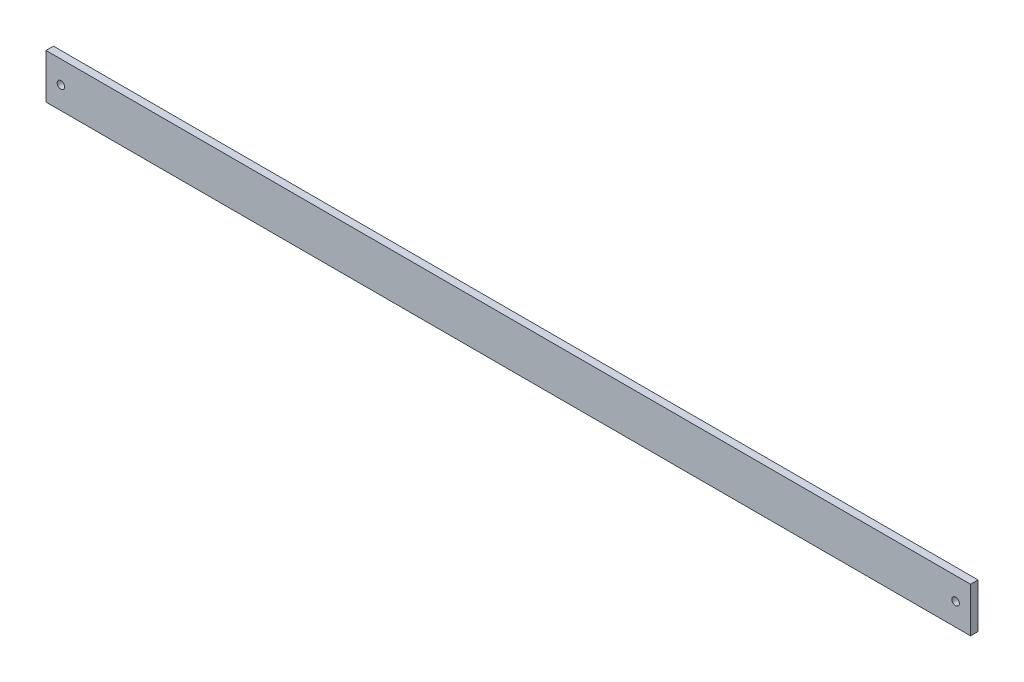
ISO-10303-21;
HEADER;
FILE_DESCRIPTION(('STEP AP214'),'2;1');
FILE_NAME('part.step','',(''),(''),'','','');
FILE_SCHEMA(('AUTOMOTIVE_DESIGN { 1 0 10303 214 1 1 1 1 }'));
ENDSEC;
DATA;
#1=APPLICATION_CONTEXT('core data for automotive mechanical design processes');
#2=APPLICATION_PROTOCOL_DEFINITION('international standard','automotive_design',2000,#1);
#3=PRODUCT_CONTEXT('',#1,'mechanical');
#4=PRODUCT('Part','Part','',(#3));
#5=PRODUCT_RELATED_PRODUCT_CATEGORY('part','',(#4));
#6=PRODUCT_DEFINITION_FORMATION('','',#4);
#7=PRODUCT_DEFINITION_CONTEXT('part definition',#1,'design');
#8=PRODUCT_DEFINITION('design','',#6,#7);
#9=PRODUCT_DEFINITION_SHAPE('','',#8);
#10=(LENGTH_UNIT() NAMED_UNIT(*) SI_UNIT(.MILLI.,.METRE.));
#11=(NAMED_UNIT(*) PLANE_ANGLE_UNIT() SI_UNIT($,.RADIAN.));
#12=(NAMED_UNIT(*) SI_UNIT($,.STERADIAN.) SOLID_ANGLE_UNIT());
#13=UNCERTAINTY_MEASURE_WITH_UNIT(LENGTH_MEASURE(1.E-05),#10,'distance_accuracy_value','');
#14=(GEOMETRIC_REPRESENTATION_CONTEXT(3) GLOBAL_UNCERTAINTY_ASSIGNED_CONTEXT((#13)) GLOBAL_UNIT_ASSIGNED_CONTEXT((#10,
#11,#12)) REPRESENTATION_CONTEXT('',''));
#15=CARTESIAN_POINT('',(0.,0.,0.));
#16=DIRECTION('',(0.,0.,1.));
#17=DIRECTION('',(1.,0.,0.));
#18=AXIS2_PLACEMENT_3D('',#15,#16,#17);
#19=CARTESIAN_POINT('',(0.,0.,3.175));
#20=DIRECTION('',(0.,0.,-1.));
#21=DIRECTION('',(-1.,0.,0.));
#22=AXIS2_PLACEMENT_3D('',#19,#20,#21);
#23=PLANE('',#22);
#24=DIRECTION('',(0.,-1.,0.));
#25=VECTOR('',#24,1.);
#26=CARTESIAN_POINT('',(0.,0.,3.175));
#27=LINE('',#26,#25);
#28=CARTESIAN_POINT('',(0.,19.05,3.175));
#29=VERTEX_POINT('',#28);
#30=CARTESIAN_POINT('',(0.,0.,3.175));
#31=VERTEX_POINT('',#30);
#32=EDGE_CURVE('E87',#29,#31,#27,.T.);
#33=ORIENTED_EDGE('',*,*,#32,.T.);
#34=DIRECTION('',(1.,0.,0.));
#35=VECTOR('',#34,1.);
#36=CARTESIAN_POINT('',(0.,0.,3.175));
#37=LINE('',#36,#35);
#38=CARTESIAN_POINT('',(393.7,0.,3.175));
#39=VERTEX_POINT('',#38);
#40=EDGE_CURVE('E82',#31,#39,#37,.T.);
#41=ORIENTED_EDGE('',*,*,#40,.T.);
#42=DIRECTION('',(0.,1.,0.));
#43=VECTOR('',#42,1.);
#44=CARTESIAN_POINT('',(393.7,0.,3.175));
#45=LINE('',#44,#43);
#46=CARTESIAN_POINT('',(393.7,19.05,3.175));
#47=VERTEX_POINT('',#46);
#48=EDGE_CURVE('E85',#39,#47,#45,.T.);
#49=ORIENTED_EDGE('',*,*,#48,.T.);
#50=DIRECTION('',(-1.,0.,0.));
#51=VECTOR('',#50,1.);
#52=CARTESIAN_POINT('',(0.,19.05,3.175));
#53=LINE('',#52,#51);
#54=EDGE_CURVE('E52',#47,#29,#53,.T.);
#55=ORIENTED_EDGE('',*,*,#54,.T.);
#56=EDGE_LOOP('',(#33,#41,#49,#55));
#57=FACE_BOUND('',#56,.T.);
#58=CARTESIAN_POINT('',(6.35,9.525,3.175));
#59=DIRECTION('',(0.,0.,1.));
#60=DIRECTION('',(1.,0.,0.));
#61=AXIS2_PLACEMENT_3D('',#58,#59,#60);
#62=CIRCLE('',#61,1.5875);
#63=CARTESIAN_POINT('',(7.9375,9.525,3.175));
#64=VERTEX_POINT('',#63);
#65=EDGE_CURVE('E102',#64,#64,#62,.T.);
#66=ORIENTED_EDGE('',*,*,#65,.F.);
#67=EDGE_LOOP('',(#66));
#68=FACE_BOUND('',#67,.T.);
#69=CARTESIAN_POINT('',(387.35,9.525,3.175));
#70=DIRECTION('',(0.,0.,1.));
#71=DIRECTION('',(1.,0.,0.));
#72=AXIS2_PLACEMENT_3D('',#69,#70,#71);
#73=CIRCLE('',#72,1.58750000000004);
#74=CARTESIAN_POINT('',(388.9375,9.525,3.175));
#75=VERTEX_POINT('',#74);
#76=EDGE_CURVE('E117',#75,#75,#73,.T.);
#77=ORIENTED_EDGE('',*,*,#76,.F.);
#78=EDGE_LOOP('',(#77));
#79=FACE_BOUND('',#78,.T.);
#80=ADVANCED_FACE('F35',(#57,#68,#79),#23,.F.);
#81=CARTESIAN_POINT('',(0.,0.,0.));
#82=DIRECTION('',(0.,0.,-1.));
#83=DIRECTION('',(-1.,0.,0.));
#84=AXIS2_PLACEMENT_3D('',#81,#82,#83);
#85=PLANE('',#84);
#86=CARTESIAN_POINT('',(6.35,9.525,0.));
#87=DIRECTION('',(0.,0.,1.));
#88=DIRECTION('',(1.,0.,0.));
#89=AXIS2_PLACEMENT_3D('',#86,#87,#88);
#90=CIRCLE('',#89,1.5875);
#91=CARTESIAN_POINT('',(7.9375,9.525,0.));
#92=VERTEX_POINT('',#91);
#93=EDGE_CURVE('E114',#92,#92,#90,.T.);
#94=ORIENTED_EDGE('',*,*,#93,.T.);
#95=EDGE_LOOP('',(#94));
#96=FACE_BOUND('',#95,.T.);
#97=DIRECTION('',(0.,-1.,0.));
#98=VECTOR('',#97,1.);
#99=CARTESIAN_POINT('',(0.,0.,0.));
#100=LINE('',#99,#98);
#101=CARTESIAN_POINT('',(0.,19.05,0.));
#102=VERTEX_POINT('',#101);
#103=CARTESIAN_POINT('',(0.,0.,0.));
#104=VERTEX_POINT('',#103);
#105=EDGE_CURVE('E99',#102,#104,#100,.T.);
#106=ORIENTED_EDGE('',*,*,#105,.F.);
#107=DIRECTION('',(-1.,0.,0.));
#108=VECTOR('',#107,1.);
#109=CARTESIAN_POINT('',(0.,19.05,0.));
#110=LINE('',#109,#108);
#111=CARTESIAN_POINT('',(393.7,19.05,0.));
#112=VERTEX_POINT('',#111);
#113=EDGE_CURVE('E75',#112,#102,#110,.T.);
#114=ORIENTED_EDGE('',*,*,#113,.F.);
#115=DIRECTION('',(0.,1.,0.));
#116=VECTOR('',#115,1.);
#117=CARTESIAN_POINT('',(393.7,0.,0.));
#118=LINE('',#117,#116);
#119=CARTESIAN_POINT('',(393.7,0.,0.));
#120=VERTEX_POINT('',#119);
#121=EDGE_CURVE('E69',#120,#112,#118,.T.);
#122=ORIENTED_EDGE('',*,*,#121,.F.);
#123=DIRECTION('',(1.,0.,0.));
#124=VECTOR('',#123,1.);
#125=CARTESIAN_POINT('',(0.,0.,0.));
#126=LINE('',#125,#124);
#127=EDGE_CURVE('E91',#104,#120,#126,.T.);
#128=ORIENTED_EDGE('',*,*,#127,.F.);
#129=EDGE_LOOP('',(#106,#114,#122,#128));
#130=FACE_BOUND('',#129,.T.);
#131=CARTESIAN_POINT('',(387.35,9.525,0.));
#132=DIRECTION('',(0.,0.,1.));
#133=DIRECTION('',(1.,0.,0.));
#134=AXIS2_PLACEMENT_3D('',#131,#132,#133);
#135=CIRCLE('',#134,1.58750000000004);
#136=CARTESIAN_POINT('',(388.9375,9.525,0.));
#137=VERTEX_POINT('',#136);
#138=EDGE_CURVE('E120',#137,#137,#135,.T.);
#139=ORIENTED_EDGE('',*,*,#138,.T.);
#140=EDGE_LOOP('',(#139));
#141=FACE_BOUND('',#140,.T.);
#142=ADVANCED_FACE('F110',(#96,#130,#141),#85,.T.);
#143=CARTESIAN_POINT('',(0.,0.,3.175));
#144=DIRECTION('',(1.,0.,0.));
#145=DIRECTION('',(0.,0.,-1.));
#146=AXIS2_PLACEMENT_3D('',#143,#144,#145);
#147=PLANE('',#146);
#148=ORIENTED_EDGE('',*,*,#105,.T.);
#149=DIRECTION('',(0.,0.,-1.));
#150=VECTOR('',#149,1.);
#151=CARTESIAN_POINT('',(0.,0.,3.175));
#152=LINE('',#151,#150);
#153=EDGE_CURVE('E11',#31,#104,#152,.T.);
#154=ORIENTED_EDGE('',*,*,#153,.F.);
#155=ORIENTED_EDGE('',*,*,#32,.F.);
#156=DIRECTION('',(0.,0.,-1.));
#157=VECTOR('',#156,1.);
#158=CARTESIAN_POINT('',(0.,19.05,3.175));
#159=LINE('',#158,#157);
#160=EDGE_CURVE('E95',#29,#102,#159,.T.);
#161=ORIENTED_EDGE('',*,*,#160,.T.);
#162=EDGE_LOOP('',(#148,#154,#155,#161));
#163=FACE_BOUND('',#162,.T.);
#164=ADVANCED_FACE('F37',(#163),#147,.F.);
#165=CARTESIAN_POINT('',(0.,0.,3.175));
#166=DIRECTION('',(0.,1.,0.));
#167=DIRECTION('',(0.,0.,1.));
#168=AXIS2_PLACEMENT_3D('',#165,#166,#167);
#169=PLANE('',#168);
#170=ORIENTED_EDGE('',*,*,#127,.T.);
#171=DIRECTION('',(0.,0.,-1.));
#172=VECTOR('',#171,1.);
#173=CARTESIAN_POINT('',(393.7,0.,3.175));
#174=LINE('',#173,#172);
#175=EDGE_CURVE('E44',#39,#120,#174,.T.);
#176=ORIENTED_EDGE('',*,*,#175,.F.);
#177=ORIENTED_EDGE('',*,*,#40,.F.);
#178=ORIENTED_EDGE('',*,*,#153,.T.);
#179=EDGE_LOOP('',(#170,#176,#177,#178));
#180=FACE_BOUND('',#179,.T.);
#181=ADVANCED_FACE('F90',(#180),#169,.F.);
#182=CARTESIAN_POINT('',(393.7,0.,3.175));
#183=DIRECTION('',(-1.,0.,0.));
#184=DIRECTION('',(0.,0.,1.));
#185=AXIS2_PLACEMENT_3D('',#182,#183,#184);
#186=PLANE('',#185);
#187=ORIENTED_EDGE('',*,*,#121,.T.);
#188=DIRECTION('',(0.,0.,-1.));
#189=VECTOR('',#188,1.);
#190=CARTESIAN_POINT('',(393.7,19.05,3.175));
#191=LINE('',#190,#189);
#192=EDGE_CURVE('E92',#47,#112,#191,.T.);
#193=ORIENTED_EDGE('',*,*,#192,.F.);
#194=ORIENTED_EDGE('',*,*,#48,.F.);
#195=ORIENTED_EDGE('',*,*,#175,.T.);
#196=EDGE_LOOP('',(#187,#193,#194,#195));
#197=FACE_BOUND('',#196,.T.);
#198=ADVANCED_FACE('F93',(#197),#186,.F.);
#199=CARTESIAN_POINT('',(0.,19.05,3.175));
#200=DIRECTION('',(0.,-1.,0.));
#201=DIRECTION('',(0.,0.,-1.));
#202=AXIS2_PLACEMENT_3D('',#199,#200,#201);
#203=PLANE('',#202);
#204=ORIENTED_EDGE('',*,*,#113,.T.);
#205=ORIENTED_EDGE('',*,*,#160,.F.);
#206=ORIENTED_EDGE('',*,*,#54,.F.);
#207=ORIENTED_EDGE('',*,*,#192,.T.);
#208=EDGE_LOOP('',(#204,#205,#206,#207));
#209=FACE_BOUND('',#208,.T.);
#210=ADVANCED_FACE('F107',(#209),#203,.F.);
#211=CARTESIAN_POINT('',(6.35,9.525,3.175));
#212=DIRECTION('',(0.,0.,-1.));
#213=DIRECTION('',(-1.,0.,0.));
#214=AXIS2_PLACEMENT_3D('',#211,#212,#213);
#215=CYLINDRICAL_SURFACE('',#214,1.5875);
#216=ORIENTED_EDGE('',*,*,#65,.T.);
#217=EDGE_LOOP('',(#216));
#218=FACE_BOUND('',#217,.T.);
#219=ORIENTED_EDGE('',*,*,#93,.F.);
#220=EDGE_LOOP('',(#219));
#221=FACE_BOUND('',#220,.T.);
#222=ADVANCED_FACE('F137',(#218,#221),#215,.F.);
#223=CARTESIAN_POINT('',(387.35,9.525,3.175));
#224=DIRECTION('',(0.,0.,-1.));
#225=DIRECTION('',(-1.,0.,0.));
#226=AXIS2_PLACEMENT_3D('',#223,#224,#225);
#227=CYLINDRICAL_SURFACE('',#226,1.58750000000004);
#228=ORIENTED_EDGE('',*,*,#76,.T.);
#229=EDGE_LOOP('',(#228));
#230=FACE_BOUND('',#229,.T.);
#231=ORIENTED_EDGE('',*,*,#138,.F.);
#232=EDGE_LOOP('',(#231));
#233=FACE_BOUND('',#232,.T.);
#234=ADVANCED_FACE('F126',(#230,#233),#227,.F.);
#235=CLOSED_SHELL('',(#80,#142,#164,#181,#198,#210,#222,#234));
#236=MANIFOLD_SOLID_BREP('B2',#235);
#237=ADVANCED_BREP_SHAPE_REPRESENTATION('',(#18,#236),#14);
#238=SHAPE_DEFINITION_REPRESENTATION(#9,#237);
ENDSEC;
END-ISO-10303-21;
